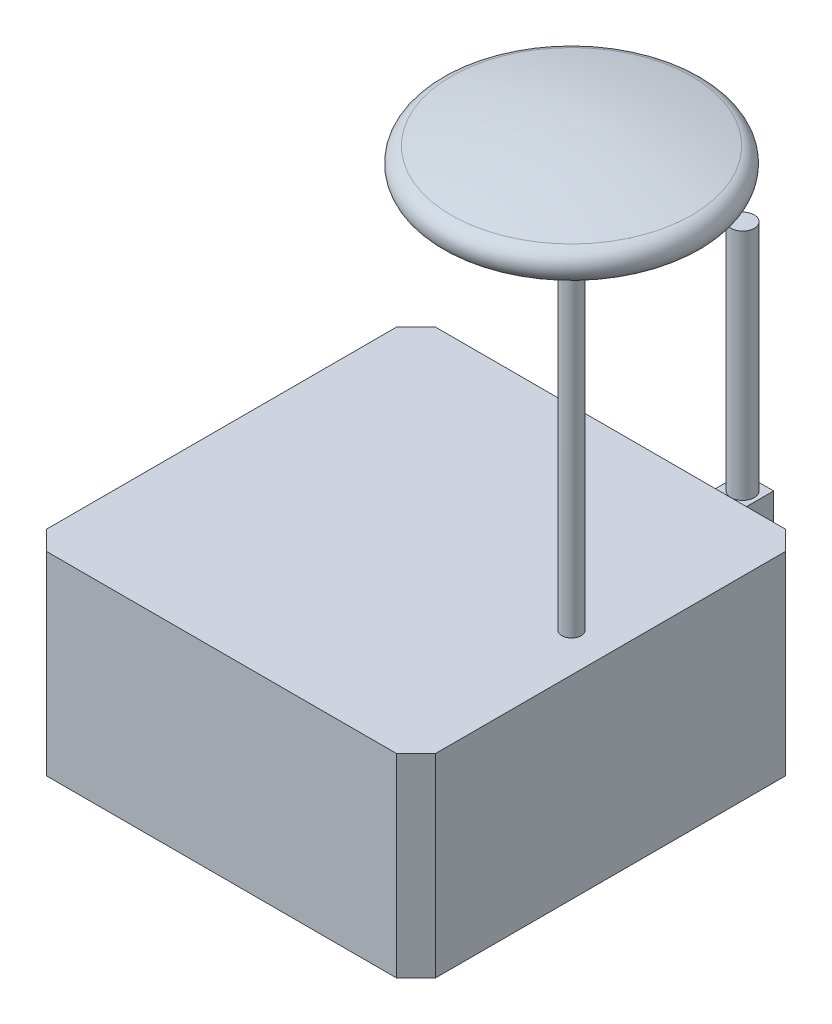
ISO-10303-21;
HEADER;
FILE_DESCRIPTION(('STEP AP214'),'2;1');
FILE_NAME('part.step','',(''),(''),'','','');
FILE_SCHEMA(('AUTOMOTIVE_DESIGN { 1 0 10303 214 1 1 1 1 }'));
ENDSEC;
DATA;
#1=APPLICATION_CONTEXT('core data for automotive mechanical design processes');
#2=APPLICATION_PROTOCOL_DEFINITION('international standard','automotive_design',2000,#1);
#3=PRODUCT_CONTEXT('',#1,'mechanical');
#4=PRODUCT('Part','Part','',(#3));
#5=PRODUCT_RELATED_PRODUCT_CATEGORY('part','',(#4));
#6=PRODUCT_DEFINITION_FORMATION('','',#4);
#7=PRODUCT_DEFINITION_CONTEXT('part definition',#1,'design');
#8=PRODUCT_DEFINITION('design','',#6,#7);
#9=PRODUCT_DEFINITION_SHAPE('','',#8);
#10=(LENGTH_UNIT() NAMED_UNIT(*) SI_UNIT(.MILLI.,.METRE.));
#11=(NAMED_UNIT(*) PLANE_ANGLE_UNIT() SI_UNIT($,.RADIAN.));
#12=(NAMED_UNIT(*) SI_UNIT($,.STERADIAN.) SOLID_ANGLE_UNIT());
#13=UNCERTAINTY_MEASURE_WITH_UNIT(LENGTH_MEASURE(1.E-05),#10,'distance_accuracy_value','');
#14=(GEOMETRIC_REPRESENTATION_CONTEXT(3) GLOBAL_UNCERTAINTY_ASSIGNED_CONTEXT((#13)) GLOBAL_UNIT_ASSIGNED_CONTEXT((#10,
#11,#12)) REPRESENTATION_CONTEXT('',''));
#15=CARTESIAN_POINT('',(0.,0.,0.));
#16=DIRECTION('',(0.,0.,1.));
#17=DIRECTION('',(1.,0.,0.));
#18=AXIS2_PLACEMENT_3D('',#15,#16,#17);
#19=CARTESIAN_POINT('',(-50.,50.,-45.));
#20=DIRECTION('',(0.707106781186547,0.,0.707106781186547));
#21=DIRECTION('',(0.707106781186548,0.,-0.707106781186548));
#22=AXIS2_PLACEMENT_3D('',#19,#20,#21);
#23=PLANE('',#22);
#24=DIRECTION('',(-0.707106781186547,0.,0.707106781186547));
#25=VECTOR('',#24,1.);
#26=CARTESIAN_POINT('',(-50.,0.,-45.));
#27=LINE('',#26,#25);
#28=CARTESIAN_POINT('',(-45.,0.,-50.));
#29=VERTEX_POINT('',#28);
#30=CARTESIAN_POINT('',(-50.,0.,-45.));
#31=VERTEX_POINT('',#30);
#32=EDGE_CURVE('E147',#29,#31,#27,.T.);
#33=ORIENTED_EDGE('',*,*,#32,.T.);
#34=DIRECTION('',(0.,-1.,0.));
#35=VECTOR('',#34,1.);
#36=CARTESIAN_POINT('',(-50.,50.,-45.));
#37=LINE('',#36,#35);
#38=CARTESIAN_POINT('',(-50.,50.,-45.));
#39=VERTEX_POINT('',#38);
#40=EDGE_CURVE('E189',#39,#31,#37,.T.);
#41=ORIENTED_EDGE('',*,*,#40,.F.);
#42=DIRECTION('',(-0.707106781186547,0.,0.707106781186547));
#43=VECTOR('',#42,1.);
#44=CARTESIAN_POINT('',(-50.,50.,-45.));
#45=LINE('',#44,#43);
#46=CARTESIAN_POINT('',(-45.,50.,-50.));
#47=VERTEX_POINT('',#46);
#48=EDGE_CURVE('E170',#47,#39,#45,.T.);
#49=ORIENTED_EDGE('',*,*,#48,.F.);
#50=DIRECTION('',(0.,-1.,0.));
#51=VECTOR('',#50,1.);
#52=CARTESIAN_POINT('',(-45.,50.,-50.));
#53=LINE('',#52,#51);
#54=EDGE_CURVE('E143',#47,#29,#53,.T.);
#55=ORIENTED_EDGE('',*,*,#54,.T.);
#56=EDGE_LOOP('',(#33,#41,#49,#55));
#57=FACE_BOUND('',#56,.T.);
#58=ADVANCED_FACE('F41',(#57),#23,.F.);
#59=CARTESIAN_POINT('',(-50.,50.,-45.));
#60=DIRECTION('',(1.,0.,0.));
#61=DIRECTION('',(0.,0.,-1.));
#62=AXIS2_PLACEMENT_3D('',#59,#60,#61);
#63=PLANE('',#62);
#64=DIRECTION('',(0.,0.,1.));
#65=VECTOR('',#64,1.);
#66=CARTESIAN_POINT('',(-50.,0.,-45.));
#67=LINE('',#66,#65);
#68=CARTESIAN_POINT('',(-50.,0.,45.));
#69=VERTEX_POINT('',#68);
#70=EDGE_CURVE('E151',#31,#69,#67,.T.);
#71=ORIENTED_EDGE('',*,*,#70,.T.);
#72=DIRECTION('',(0.,-1.,0.));
#73=VECTOR('',#72,1.);
#74=CARTESIAN_POINT('',(-50.,50.,45.));
#75=LINE('',#74,#73);
#76=CARTESIAN_POINT('',(-50.,50.,45.));
#77=VERTEX_POINT('',#76);
#78=EDGE_CURVE('E185',#77,#69,#75,.T.);
#79=ORIENTED_EDGE('',*,*,#78,.F.);
#80=DIRECTION('',(0.,0.,1.));
#81=VECTOR('',#80,1.);
#82=CARTESIAN_POINT('',(-50.,50.,-45.));
#83=LINE('',#82,#81);
#84=EDGE_CURVE('E104',#39,#77,#83,.T.);
#85=ORIENTED_EDGE('',*,*,#84,.F.);
#86=ORIENTED_EDGE('',*,*,#40,.T.);
#87=EDGE_LOOP('',(#71,#79,#85,#86));
#88=FACE_BOUND('',#87,.T.);
#89=ADVANCED_FACE('F215',(#88),#63,.F.);
#90=CARTESIAN_POINT('',(-50.,50.,45.));
#91=DIRECTION('',(0.707106781186547,0.,-0.707106781186547));
#92=DIRECTION('',(-0.707106781186548,0.,-0.707106781186548));
#93=AXIS2_PLACEMENT_3D('',#90,#91,#92);
#94=PLANE('',#93);
#95=DIRECTION('',(0.707106781186547,0.,0.707106781186547));
#96=VECTOR('',#95,1.);
#97=CARTESIAN_POINT('',(-50.,0.,45.));
#98=LINE('',#97,#96);
#99=CARTESIAN_POINT('',(-45.,0.,50.));
#100=VERTEX_POINT('',#99);
#101=EDGE_CURVE('E155',#69,#100,#98,.T.);
#102=ORIENTED_EDGE('',*,*,#101,.T.);
#103=DIRECTION('',(0.,-1.,0.));
#104=VECTOR('',#103,1.);
#105=CARTESIAN_POINT('',(-45.,50.,50.));
#106=LINE('',#105,#104);
#107=CARTESIAN_POINT('',(-45.,50.,50.));
#108=VERTEX_POINT('',#107);
#109=EDGE_CURVE('E181',#108,#100,#106,.T.);
#110=ORIENTED_EDGE('',*,*,#109,.F.);
#111=DIRECTION('',(0.707106781186547,0.,0.707106781186547));
#112=VECTOR('',#111,1.);
#113=CARTESIAN_POINT('',(-50.,50.,45.));
#114=LINE('',#113,#112);
#115=EDGE_CURVE('E230',#77,#108,#114,.T.);
#116=ORIENTED_EDGE('',*,*,#115,.F.);
#117=ORIENTED_EDGE('',*,*,#78,.T.);
#118=EDGE_LOOP('',(#102,#110,#116,#117));
#119=FACE_BOUND('',#118,.T.);
#120=ADVANCED_FACE('F220',(#119),#94,.F.);
#121=CARTESIAN_POINT('',(-45.,50.,50.));
#122=DIRECTION('',(0.,0.,-1.));
#123=DIRECTION('',(-1.,0.,0.));
#124=AXIS2_PLACEMENT_3D('',#121,#122,#123);
#125=PLANE('',#124);
#126=DIRECTION('',(1.,0.,0.));
#127=VECTOR('',#126,1.);
#128=CARTESIAN_POINT('',(-45.,0.,50.));
#129=LINE('',#128,#127);
#130=CARTESIAN_POINT('',(45.,0.,50.));
#131=VERTEX_POINT('',#130);
#132=EDGE_CURVE('E158',#100,#131,#129,.T.);
#133=ORIENTED_EDGE('',*,*,#132,.T.);
#134=DIRECTION('',(0.,-1.,0.));
#135=VECTOR('',#134,1.);
#136=CARTESIAN_POINT('',(45.,50.,50.));
#137=LINE('',#136,#135);
#138=CARTESIAN_POINT('',(45.,50.,50.));
#139=VERTEX_POINT('',#138);
#140=EDGE_CURVE('E177',#139,#131,#137,.T.);
#141=ORIENTED_EDGE('',*,*,#140,.F.);
#142=DIRECTION('',(1.,0.,0.));
#143=VECTOR('',#142,1.);
#144=CARTESIAN_POINT('',(-45.,50.,50.));
#145=LINE('',#144,#143);
#146=EDGE_CURVE('E233',#108,#139,#145,.T.);
#147=ORIENTED_EDGE('',*,*,#146,.F.);
#148=ORIENTED_EDGE('',*,*,#109,.T.);
#149=EDGE_LOOP('',(#133,#141,#147,#148));
#150=FACE_BOUND('',#149,.T.);
#151=ADVANCED_FACE('F434',(#150),#125,.F.);
#152=CARTESIAN_POINT('',(45.,50.,50.));
#153=DIRECTION('',(-0.707106781186547,0.,-0.707106781186547));
#154=DIRECTION('',(-0.707106781186548,0.,0.707106781186548));
#155=AXIS2_PLACEMENT_3D('',#152,#153,#154);
#156=PLANE('',#155);
#157=DIRECTION('',(0.707106781186547,0.,-0.707106781186547));
#158=VECTOR('',#157,1.);
#159=CARTESIAN_POINT('',(45.,0.,50.));
#160=LINE('',#159,#158);
#161=CARTESIAN_POINT('',(50.,0.,45.));
#162=VERTEX_POINT('',#161);
#163=EDGE_CURVE('E161',#131,#162,#160,.T.);
#164=ORIENTED_EDGE('',*,*,#163,.T.);
#165=DIRECTION('',(0.,-1.,0.));
#166=VECTOR('',#165,1.);
#167=CARTESIAN_POINT('',(50.,50.,45.));
#168=LINE('',#167,#166);
#169=CARTESIAN_POINT('',(50.,50.,45.));
#170=VERTEX_POINT('',#169);
#171=EDGE_CURVE('E136',#170,#162,#168,.T.);
#172=ORIENTED_EDGE('',*,*,#171,.F.);
#173=DIRECTION('',(0.707106781186547,0.,-0.707106781186547));
#174=VECTOR('',#173,1.);
#175=CARTESIAN_POINT('',(45.,50.,50.));
#176=LINE('',#175,#174);
#177=EDGE_CURVE('E125',#139,#170,#176,.T.);
#178=ORIENTED_EDGE('',*,*,#177,.F.);
#179=ORIENTED_EDGE('',*,*,#140,.T.);
#180=EDGE_LOOP('',(#164,#172,#178,#179));
#181=FACE_BOUND('',#180,.T.);
#182=ADVANCED_FACE('F426',(#181),#156,.F.);
#183=CARTESIAN_POINT('',(50.,50.,-45.));
#184=DIRECTION('',(-1.,0.,0.));
#185=DIRECTION('',(0.,0.,1.));
#186=AXIS2_PLACEMENT_3D('',#183,#184,#185);
#187=PLANE('',#186);
#188=DIRECTION('',(0.,0.,-1.));
#189=VECTOR('',#188,1.);
#190=CARTESIAN_POINT('',(50.,0.,-45.));
#191=LINE('',#190,#189);
#192=CARTESIAN_POINT('',(50.,0.,-45.));
#193=VERTEX_POINT('',#192);
#194=EDGE_CURVE('E134',#162,#193,#191,.T.);
#195=ORIENTED_EDGE('',*,*,#194,.T.);
#196=DIRECTION('',(0.,-1.,0.));
#197=VECTOR('',#196,1.);
#198=CARTESIAN_POINT('',(50.,50.,-45.));
#199=LINE('',#198,#197);
#200=CARTESIAN_POINT('',(50.,50.,-45.));
#201=VERTEX_POINT('',#200);
#202=EDGE_CURVE('E131',#201,#193,#199,.T.);
#203=ORIENTED_EDGE('',*,*,#202,.F.);
#204=DIRECTION('',(0.,0.,-1.));
#205=VECTOR('',#204,1.);
#206=CARTESIAN_POINT('',(50.,50.,-45.));
#207=LINE('',#206,#205);
#208=EDGE_CURVE('E119',#170,#201,#207,.T.);
#209=ORIENTED_EDGE('',*,*,#208,.F.);
#210=ORIENTED_EDGE('',*,*,#171,.T.);
#211=EDGE_LOOP('',(#195,#203,#209,#210));
#212=FACE_BOUND('',#211,.T.);
#213=ADVANCED_FACE('F132',(#212),#187,.F.);
#214=CARTESIAN_POINT('',(45.,50.,-50.));
#215=DIRECTION('',(-0.707106781186547,0.,0.707106781186547));
#216=DIRECTION('',(0.707106781186548,0.,0.707106781186548));
#217=AXIS2_PLACEMENT_3D('',#214,#215,#216);
#218=PLANE('',#217);
#219=DIRECTION('',(-0.707106781186547,0.,-0.707106781186547));
#220=VECTOR('',#219,1.);
#221=CARTESIAN_POINT('',(45.,0.,-50.));
#222=LINE('',#221,#220);
#223=CARTESIAN_POINT('',(45.,0.,-50.));
#224=VERTEX_POINT('',#223);
#225=EDGE_CURVE('E89',#193,#224,#222,.T.);
#226=ORIENTED_EDGE('',*,*,#225,.T.);
#227=DIRECTION('',(0.,-1.,0.));
#228=VECTOR('',#227,1.);
#229=CARTESIAN_POINT('',(45.,50.,-50.));
#230=LINE('',#229,#228);
#231=CARTESIAN_POINT('',(45.,50.,-50.));
#232=VERTEX_POINT('',#231);
#233=EDGE_CURVE('E137',#232,#224,#230,.T.);
#234=ORIENTED_EDGE('',*,*,#233,.F.);
#235=DIRECTION('',(-0.707106781186547,0.,-0.707106781186547));
#236=VECTOR('',#235,1.);
#237=CARTESIAN_POINT('',(45.,50.,-50.));
#238=LINE('',#237,#236);
#239=EDGE_CURVE('E123',#201,#232,#238,.T.);
#240=ORIENTED_EDGE('',*,*,#239,.F.);
#241=ORIENTED_EDGE('',*,*,#202,.T.);
#242=EDGE_LOOP('',(#226,#234,#240,#241));
#243=FACE_BOUND('',#242,.T.);
#244=ADVANCED_FACE('F139',(#243),#218,.F.);
#245=CARTESIAN_POINT('',(-45.,50.,-50.));
#246=DIRECTION('',(0.,0.,1.));
#247=DIRECTION('',(1.,0.,0.));
#248=AXIS2_PLACEMENT_3D('',#245,#246,#247);
#249=PLANE('',#248);
#250=CARTESIAN_POINT('',(25.,40.,-50.));
#251=DIRECTION('',(0.,0.,1.));
#252=DIRECTION('',(1.,0.,0.));
#253=AXIS2_PLACEMENT_3D('',#250,#251,#252);
#254=CIRCLE('',#253,2.5);
#255=CARTESIAN_POINT('',(27.5,40.,-50.));
#256=VERTEX_POINT('',#255);
#257=EDGE_CURVE('E44',#256,#256,#254,.F.);
#258=ORIENTED_EDGE('',*,*,#257,.F.);
#259=EDGE_LOOP('',(#258));
#260=FACE_BOUND('',#259,.T.);
#261=DIRECTION('',(-1.,0.,0.));
#262=VECTOR('',#261,1.);
#263=CARTESIAN_POINT('',(-45.,0.,-50.));
#264=LINE('',#263,#262);
#265=EDGE_CURVE('E95',#224,#29,#264,.T.);
#266=ORIENTED_EDGE('',*,*,#265,.T.);
#267=ORIENTED_EDGE('',*,*,#54,.F.);
#268=DIRECTION('',(-1.,0.,0.));
#269=VECTOR('',#268,1.);
#270=CARTESIAN_POINT('',(-45.,50.,-50.));
#271=LINE('',#270,#269);
#272=EDGE_CURVE('E59',#232,#47,#271,.T.);
#273=ORIENTED_EDGE('',*,*,#272,.F.);
#274=ORIENTED_EDGE('',*,*,#233,.T.);
#275=EDGE_LOOP('',(#266,#267,#273,#274));
#276=FACE_BOUND('',#275,.T.);
#277=ADVANCED_FACE('F202',(#260,#276),#249,.F.);
#278=CARTESIAN_POINT('',(0.,50.,0.));
#279=DIRECTION('',(0.,-1.,0.));
#280=DIRECTION('',(0.,0.,-1.));
#281=AXIS2_PLACEMENT_3D('',#278,#279,#280);
#282=PLANE('',#281);
#283=CARTESIAN_POINT('',(40.,50.,0.));
#284=DIRECTION('',(0.,-1.,0.));
#285=DIRECTION('',(0.,0.,-1.));
#286=AXIS2_PLACEMENT_3D('',#283,#284,#285);
#287=CIRCLE('',#286,2.5);
#288=CARTESIAN_POINT('',(40.,50.,-2.5));
#289=VERTEX_POINT('',#288);
#290=EDGE_CURVE('E191',#289,#289,#287,.F.);
#291=ORIENTED_EDGE('',*,*,#290,.F.);
#292=EDGE_LOOP('',(#291));
#293=FACE_BOUND('',#292,.T.);
#294=ORIENTED_EDGE('',*,*,#48,.T.);
#295=ORIENTED_EDGE('',*,*,#84,.T.);
#296=ORIENTED_EDGE('',*,*,#115,.T.);
#297=ORIENTED_EDGE('',*,*,#146,.T.);
#298=ORIENTED_EDGE('',*,*,#177,.T.);
#299=ORIENTED_EDGE('',*,*,#208,.T.);
#300=ORIENTED_EDGE('',*,*,#239,.T.);
#301=ORIENTED_EDGE('',*,*,#272,.T.);
#302=EDGE_LOOP('',(#294,#295,#296,#297,#298,#299,#300,#301));
#303=FACE_BOUND('',#302,.T.);
#304=ADVANCED_FACE('F121',(#293,#303),#282,.F.);
#305=CARTESIAN_POINT('',(0.,0.,0.));
#306=DIRECTION('',(0.,-1.,0.));
#307=DIRECTION('',(0.,0.,-1.));
#308=AXIS2_PLACEMENT_3D('',#305,#306,#307);
#309=PLANE('',#308);
#310=ORIENTED_EDGE('',*,*,#32,.F.);
#311=ORIENTED_EDGE('',*,*,#265,.F.);
#312=ORIENTED_EDGE('',*,*,#225,.F.);
#313=ORIENTED_EDGE('',*,*,#194,.F.);
#314=ORIENTED_EDGE('',*,*,#163,.F.);
#315=ORIENTED_EDGE('',*,*,#132,.F.);
#316=ORIENTED_EDGE('',*,*,#101,.F.);
#317=ORIENTED_EDGE('',*,*,#70,.F.);
#318=EDGE_LOOP('',(#310,#311,#312,#313,#314,#315,#316,#317));
#319=FACE_BOUND('',#318,.T.);
#320=ADVANCED_FACE('F209',(#319),#309,.T.);
#321=CARTESIAN_POINT('',(40.,150.,0.));
#322=DIRECTION('',(0.,-1.,0.));
#323=DIRECTION('',(0.,0.,-1.));
#324=AXIS2_PLACEMENT_3D('',#321,#322,#323);
#325=CYLINDRICAL_SURFACE('',#324,2.5);
#326=CARTESIAN_POINT('',(40.,150.,0.));
#327=DIRECTION('',(0.,1.,0.));
#328=DIRECTION('',(0.,0.,1.));
#329=AXIS2_PLACEMENT_3D('',#326,#327,#328);
#330=CIRCLE('',#329,2.5);
#331=CARTESIAN_POINT('',(40.,150.,2.5));
#332=VERTEX_POINT('',#331);
#333=EDGE_CURVE('E152',#332,#332,#330,.T.);
#334=ORIENTED_EDGE('',*,*,#333,.F.);
#335=EDGE_LOOP('',(#334));
#336=FACE_BOUND('',#335,.T.);
#337=ORIENTED_EDGE('',*,*,#290,.T.);
#338=EDGE_LOOP('',(#337));
#339=FACE_BOUND('',#338,.T.);
#340=ADVANCED_FACE('F277',(#336,#339),#325,.T.);
#341=CARTESIAN_POINT('',(40.,150.,0.));
#342=DIRECTION('',(0.,-1.,0.));
#343=DIRECTION('',(0.,0.,-1.));
#344=AXIS2_PLACEMENT_3D('',#341,#342,#343);
#345=PLANE('',#344);
#346=ORIENTED_EDGE('',*,*,#333,.T.);
#347=EDGE_LOOP('',(#346));
#348=FACE_BOUND('',#347,.T.);
#349=CARTESIAN_POINT('',(40.,150.,0.));
#350=DIRECTION('',(0.,-1.,0.));
#351=DIRECTION('',(0.,0.,-1.));
#352=AXIS2_PLACEMENT_3D('',#349,#350,#351);
#353=CIRCLE('',#352,30.);
#354=CARTESIAN_POINT('',(40.,150.,-30.));
#355=VERTEX_POINT('',#354);
#356=EDGE_CURVE('E246',#355,#355,#353,.T.);
#357=ORIENTED_EDGE('',*,*,#356,.T.);
#358=EDGE_LOOP('',(#357));
#359=FACE_BOUND('',#358,.T.);
#360=ADVANCED_FACE('F273',(#348,#359),#345,.T.);
#361=CARTESIAN_POINT('',(40.,154.,0.));
#362=DIRECTION('',(0.,-1.,0.));
#363=DIRECTION('',(0.,0.,-1.));
#364=AXIS2_PLACEMENT_3D('',#361,#362,#363);
#365=TOROIDAL_SURFACE('',#364,30.,4.00000000000001);
#366=CARTESIAN_POINT('',(40.,157.886525358806,0.));
#367=DIRECTION('',(0.,-1.,0.));
#368=DIRECTION('',(0.,0.,-1.));
#369=AXIS2_PLACEMENT_3D('',#366,#367,#368);
#370=CIRCLE('',#369,30.9460024499744);
#371=CARTESIAN_POINT('',(40.,157.886525358806,-30.9460024499744));
#372=VERTEX_POINT('',#371);
#373=EDGE_CURVE('E250',#372,#372,#370,.T.);
#374=ORIENTED_EDGE('',*,*,#373,.T.);
#375=EDGE_LOOP('',(#374));
#376=FACE_BOUND('',#375,.T.);
#377=ORIENTED_EDGE('',*,*,#356,.F.);
#378=EDGE_LOOP('',(#377));
#379=FACE_BOUND('',#378,.T.);
#380=ADVANCED_FACE('F268',(#376,#379),#365,.T.);
#381=CARTESIAN_POINT('',(70.9460024499744,157.886525358806,0.));
#382=CARTESIAN_POINT('',(61.6441319437984,160.150653719181,0.));
#383=CARTESIAN_POINT('',(49.3625431798435,162.224748331939,0.));
#384=CARTESIAN_POINT('',(40.,161.880718379067,0.));
#385=B_SPLINE_CURVE_WITH_KNOTS('',3,(#381,#382,#383,#384),.UNSPECIFIED.,.F.,.F.,(4,4),(0.,1.),.UNSPECIFIED.);
#386=CARTESIAN_POINT('',(40.,150.,0.));
#387=DIRECTION('',(0.,-1.,0.));
#388=AXIS1_PLACEMENT('',#386,#387);
#389=SURFACE_OF_REVOLUTION('',#385,#388);
#390=CARTESIAN_POINT('',(40.,161.880718379067,0.));
#391=VERTEX_POINT('',#390);
#392=VERTEX_LOOP('',#391);
#393=FACE_BOUND('',#392,.T.);
#394=ORIENTED_EDGE('',*,*,#373,.F.);
#395=EDGE_LOOP('',(#394));
#396=FACE_BOUND('',#395,.T.);
#397=ADVANCED_FACE('F264',(#393,#396),#389,.F.);
#398=CARTESIAN_POINT('',(25.,40.,-55.));
#399=DIRECTION('',(0.,0.,1.));
#400=DIRECTION('',(1.,0.,0.));
#401=AXIS2_PLACEMENT_3D('',#398,#399,#400);
#402=CYLINDRICAL_SURFACE('',#401,2.5);
#403=CARTESIAN_POINT('',(25.,40.,-55.));
#404=DIRECTION('',(0.,0.,-1.));
#405=DIRECTION('',(-1.,0.,0.));
#406=AXIS2_PLACEMENT_3D('',#403,#404,#405);
#407=CIRCLE('',#406,2.5);
#408=CARTESIAN_POINT('',(22.5,40.,-55.));
#409=VERTEX_POINT('',#408);
#410=EDGE_CURVE('E254',#409,#409,#407,.T.);
#411=ORIENTED_EDGE('',*,*,#410,.F.);
#412=EDGE_LOOP('',(#411));
#413=FACE_BOUND('',#412,.T.);
#414=ORIENTED_EDGE('',*,*,#257,.T.);
#415=EDGE_LOOP('',(#414));
#416=FACE_BOUND('',#415,.T.);
#417=ADVANCED_FACE('F200',(#413,#416),#402,.T.);
#418=CARTESIAN_POINT('',(21.,44.,-63.));
#419=DIRECTION('',(1.,0.,0.));
#420=DIRECTION('',(0.,1.,0.));
#421=AXIS2_PLACEMENT_3D('',#418,#419,#420);
#422=PLANE('',#421);
#423=DIRECTION('',(0.,1.,0.));
#424=VECTOR('',#423,1.);
#425=CARTESIAN_POINT('',(21.,44.,-55.));
#426=LINE('',#425,#424);
#427=CARTESIAN_POINT('',(21.,36.,-55.));
#428=VERTEX_POINT('',#427);
#429=CARTESIAN_POINT('',(21.,44.,-55.));
#430=VERTEX_POINT('',#429);
#431=EDGE_CURVE('E473',#428,#430,#426,.T.);
#432=ORIENTED_EDGE('',*,*,#431,.T.);
#433=DIRECTION('',(0.,0.,1.));
#434=VECTOR('',#433,1.);
#435=CARTESIAN_POINT('',(21.,44.,-63.));
#436=LINE('',#435,#434);
#437=CARTESIAN_POINT('',(21.,44.,-63.));
#438=VERTEX_POINT('',#437);
#439=EDGE_CURVE('E518',#438,#430,#436,.T.);
#440=ORIENTED_EDGE('',*,*,#439,.F.);
#441=DIRECTION('',(0.,1.,0.));
#442=VECTOR('',#441,1.);
#443=CARTESIAN_POINT('',(21.,44.,-63.));
#444=LINE('',#443,#442);
#445=CARTESIAN_POINT('',(21.,36.,-63.));
#446=VERTEX_POINT('',#445);
#447=EDGE_CURVE('E480',#446,#438,#444,.T.);
#448=ORIENTED_EDGE('',*,*,#447,.F.);
#449=DIRECTION('',(0.,0.,1.));
#450=VECTOR('',#449,1.);
#451=CARTESIAN_POINT('',(21.,36.,-63.));
#452=LINE('',#451,#450);
#453=EDGE_CURVE('E496',#446,#428,#452,.T.);
#454=ORIENTED_EDGE('',*,*,#453,.T.);
#455=EDGE_LOOP('',(#432,#440,#448,#454));
#456=FACE_BOUND('',#455,.T.);
#457=ADVANCED_FACE('F310',(#456),#422,.F.);
#458=CARTESIAN_POINT('',(29.,44.,-63.));
#459=DIRECTION('',(0.,-1.,0.));
#460=DIRECTION('',(0.,0.,-1.));
#461=AXIS2_PLACEMENT_3D('',#458,#459,#460);
#462=PLANE('',#461);
#463=CARTESIAN_POINT('',(25.,44.,-59.));
#464=DIRECTION('',(0.,1.,0.));
#465=DIRECTION('',(0.,0.,1.));
#466=AXIS2_PLACEMENT_3D('',#463,#464,#465);
#467=CIRCLE('',#466,3.);
#468=CARTESIAN_POINT('',(25.,44.,-56.));
#469=VERTEX_POINT('',#468);
#470=EDGE_CURVE('E11',#469,#469,#467,.T.);
#471=ORIENTED_EDGE('',*,*,#470,.F.);
#472=EDGE_LOOP('',(#471));
#473=FACE_BOUND('',#472,.T.);
#474=DIRECTION('',(1.,0.,0.));
#475=VECTOR('',#474,1.);
#476=CARTESIAN_POINT('',(29.,44.,-55.));
#477=LINE('',#476,#475);
#478=CARTESIAN_POINT('',(29.,44.,-55.));
#479=VERTEX_POINT('',#478);
#480=EDGE_CURVE('E477',#430,#479,#477,.T.);
#481=ORIENTED_EDGE('',*,*,#480,.T.);
#482=DIRECTION('',(0.,0.,1.));
#483=VECTOR('',#482,1.);
#484=CARTESIAN_POINT('',(29.,44.,-63.));
#485=LINE('',#484,#483);
#486=CARTESIAN_POINT('',(29.,44.,-63.));
#487=VERTEX_POINT('',#486);
#488=EDGE_CURVE('E515',#487,#479,#485,.T.);
#489=ORIENTED_EDGE('',*,*,#488,.F.);
#490=DIRECTION('',(1.,0.,0.));
#491=VECTOR('',#490,1.);
#492=CARTESIAN_POINT('',(29.,44.,-63.));
#493=LINE('',#492,#491);
#494=EDGE_CURVE('E484',#438,#487,#493,.T.);
#495=ORIENTED_EDGE('',*,*,#494,.F.);
#496=ORIENTED_EDGE('',*,*,#439,.T.);
#497=EDGE_LOOP('',(#481,#489,#495,#496));
#498=FACE_BOUND('',#497,.T.);
#499=ADVANCED_FACE('F317',(#473,#498),#462,.F.);
#500=CARTESIAN_POINT('',(29.,44.,-63.));
#501=DIRECTION('',(-1.,0.,0.));
#502=DIRECTION('',(0.,0.,1.));
#503=AXIS2_PLACEMENT_3D('',#500,#501,#502);
#504=PLANE('',#503);
#505=DIRECTION('',(0.,-1.,0.));
#506=VECTOR('',#505,1.);
#507=CARTESIAN_POINT('',(29.,44.,-55.));
#508=LINE('',#507,#506);
#509=CARTESIAN_POINT('',(29.,36.,-55.));
#510=VERTEX_POINT('',#509);
#511=EDGE_CURVE('E501',#479,#510,#508,.T.);
#512=ORIENTED_EDGE('',*,*,#511,.T.);
#513=DIRECTION('',(0.,0.,1.));
#514=VECTOR('',#513,1.);
#515=CARTESIAN_POINT('',(29.,36.,-63.));
#516=LINE('',#515,#514);
#517=CARTESIAN_POINT('',(29.,36.,-63.));
#518=VERTEX_POINT('',#517);
#519=EDGE_CURVE('E511',#518,#510,#516,.T.);
#520=ORIENTED_EDGE('',*,*,#519,.F.);
#521=DIRECTION('',(0.,-1.,0.));
#522=VECTOR('',#521,1.);
#523=CARTESIAN_POINT('',(29.,44.,-63.));
#524=LINE('',#523,#522);
#525=EDGE_CURVE('E489',#487,#518,#524,.T.);
#526=ORIENTED_EDGE('',*,*,#525,.F.);
#527=ORIENTED_EDGE('',*,*,#488,.T.);
#528=EDGE_LOOP('',(#512,#520,#526,#527));
#529=FACE_BOUND('',#528,.T.);
#530=ADVANCED_FACE('F325',(#529),#504,.F.);
#531=CARTESIAN_POINT('',(29.,36.,-63.));
#532=DIRECTION('',(0.,1.,0.));
#533=DIRECTION('',(0.,0.,1.));
#534=AXIS2_PLACEMENT_3D('',#531,#532,#533);
#535=PLANE('',#534);
#536=DIRECTION('',(-1.,0.,0.));
#537=VECTOR('',#536,1.);
#538=CARTESIAN_POINT('',(29.,36.,-55.));
#539=LINE('',#538,#537);
#540=EDGE_CURVE('E485',#510,#428,#539,.T.);
#541=ORIENTED_EDGE('',*,*,#540,.T.);
#542=ORIENTED_EDGE('',*,*,#453,.F.);
#543=DIRECTION('',(-1.,0.,0.));
#544=VECTOR('',#543,1.);
#545=CARTESIAN_POINT('',(29.,36.,-63.));
#546=LINE('',#545,#544);
#547=EDGE_CURVE('E493',#518,#446,#546,.T.);
#548=ORIENTED_EDGE('',*,*,#547,.F.);
#549=ORIENTED_EDGE('',*,*,#519,.T.);
#550=EDGE_LOOP('',(#541,#542,#548,#549));
#551=FACE_BOUND('',#550,.T.);
#552=ADVANCED_FACE('F334',(#551),#535,.F.);
#553=CARTESIAN_POINT('',(0.,0.,-63.));
#554=DIRECTION('',(0.,0.,-1.));
#555=DIRECTION('',(-1.,0.,0.));
#556=AXIS2_PLACEMENT_3D('',#553,#554,#555);
#557=PLANE('',#556);
#558=ORIENTED_EDGE('',*,*,#447,.T.);
#559=ORIENTED_EDGE('',*,*,#494,.T.);
#560=ORIENTED_EDGE('',*,*,#525,.T.);
#561=ORIENTED_EDGE('',*,*,#547,.T.);
#562=EDGE_LOOP('',(#558,#559,#560,#561));
#563=FACE_BOUND('',#562,.T.);
#564=ADVANCED_FACE('F342',(#563),#557,.T.);
#565=CARTESIAN_POINT('',(0.,0.,-55.));
#566=DIRECTION('',(0.,0.,-1.));
#567=DIRECTION('',(-1.,0.,0.));
#568=AXIS2_PLACEMENT_3D('',#565,#566,#567);
#569=PLANE('',#568);
#570=ORIENTED_EDGE('',*,*,#410,.T.);
#571=EDGE_LOOP('',(#570));
#572=FACE_BOUND('',#571,.T.);
#573=ORIENTED_EDGE('',*,*,#431,.F.);
#574=ORIENTED_EDGE('',*,*,#540,.F.);
#575=ORIENTED_EDGE('',*,*,#511,.F.);
#576=ORIENTED_EDGE('',*,*,#480,.F.);
#577=EDGE_LOOP('',(#573,#574,#575,#576));
#578=FACE_BOUND('',#577,.T.);
#579=ADVANCED_FACE('F350',(#572,#578),#569,.F.);
#580=CARTESIAN_POINT('',(25.,104.,-59.));
#581=DIRECTION('',(0.,-1.,0.));
#582=DIRECTION('',(0.,0.,-1.));
#583=AXIS2_PLACEMENT_3D('',#580,#581,#582);
#584=CYLINDRICAL_SURFACE('',#583,3.);
#585=CARTESIAN_POINT('',(25.,104.,-59.));
#586=DIRECTION('',(0.,1.,0.));
#587=DIRECTION('',(0.,0.,1.));
#588=AXIS2_PLACEMENT_3D('',#585,#586,#587);
#589=CIRCLE('',#588,3.);
#590=CARTESIAN_POINT('',(25.,104.,-56.));
#591=VERTEX_POINT('',#590);
#592=EDGE_CURVE('E471',#591,#591,#589,.T.);
#593=ORIENTED_EDGE('',*,*,#592,.F.);
#594=EDGE_LOOP('',(#593));
#595=FACE_BOUND('',#594,.T.);
#596=ORIENTED_EDGE('',*,*,#470,.T.);
#597=EDGE_LOOP('',(#596));
#598=FACE_BOUND('',#597,.T.);
#599=ADVANCED_FACE('F357',(#595,#598),#584,.T.);
#600=CARTESIAN_POINT('',(25.,104.,-59.));
#601=DIRECTION('',(0.,1.,0.));
#602=DIRECTION('',(0.,0.,1.));
#603=AXIS2_PLACEMENT_3D('',#600,#601,#602);
#604=PLANE('',#603);
#605=ORIENTED_EDGE('',*,*,#592,.T.);
#606=EDGE_LOOP('',(#605));
#607=FACE_BOUND('',#606,.T.);
#608=ADVANCED_FACE('F364',(#607),#604,.T.);
#609=CLOSED_SHELL('',(#58,#89,#120,#151,#182,#213,#244,#277,#304,#320,#340,#360,#380,#397,#417,
#457,#499,#530,#552,#564,#579,#599,#608));
#610=MANIFOLD_SOLID_BREP('B2',#609);
#611=ADVANCED_BREP_SHAPE_REPRESENTATION('',(#18,#610),#14);
#612=SHAPE_DEFINITION_REPRESENTATION(#9,#611);
ENDSEC;
END-ISO-10303-21;
